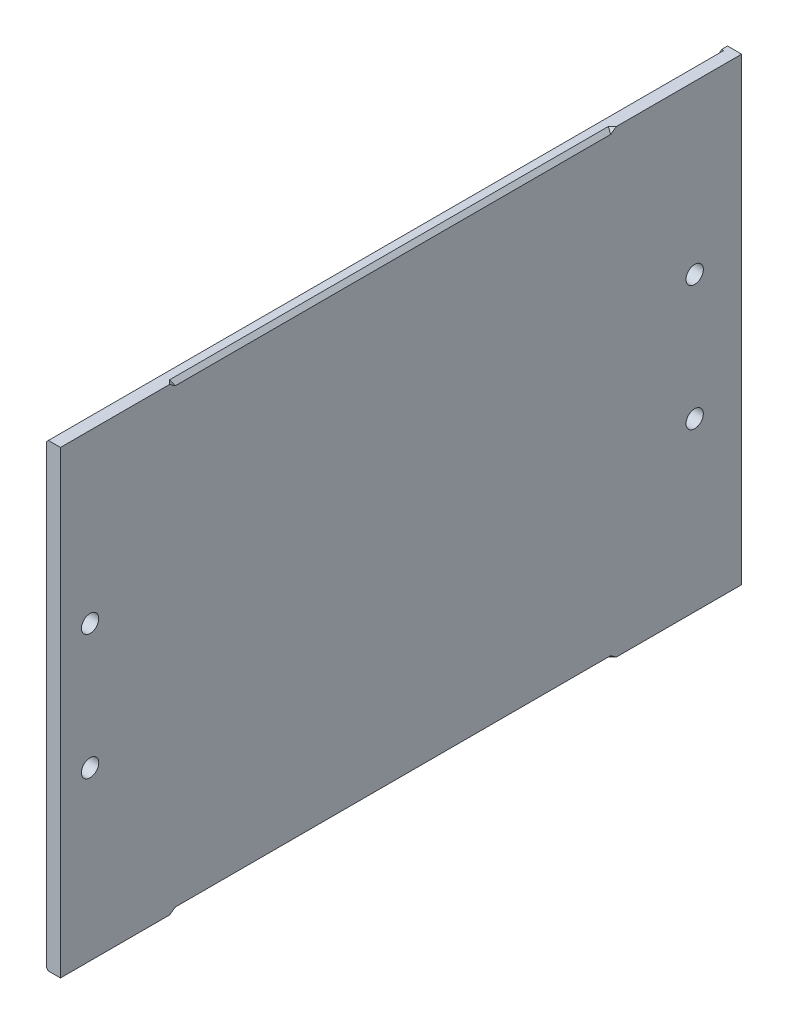
ISO-10303-21;
HEADER;
FILE_DESCRIPTION(('STEP AP214'),'2;1');
FILE_NAME('part.step','',(''),(''),'','','');
FILE_SCHEMA(('AUTOMOTIVE_DESIGN { 1 0 10303 214 1 1 1 1 }'));
ENDSEC;
DATA;
#1=APPLICATION_CONTEXT('core data for automotive mechanical design processes');
#2=APPLICATION_PROTOCOL_DEFINITION('international standard','automotive_design',2000,#1);
#3=PRODUCT_CONTEXT('',#1,'mechanical');
#4=PRODUCT('Part','Part','',(#3));
#5=PRODUCT_RELATED_PRODUCT_CATEGORY('part','',(#4));
#6=PRODUCT_DEFINITION_FORMATION('','',#4);
#7=PRODUCT_DEFINITION_CONTEXT('part definition',#1,'design');
#8=PRODUCT_DEFINITION('design','',#6,#7);
#9=PRODUCT_DEFINITION_SHAPE('','',#8);
#10=(LENGTH_UNIT() NAMED_UNIT(*) SI_UNIT(.MILLI.,.METRE.));
#11=(NAMED_UNIT(*) PLANE_ANGLE_UNIT() SI_UNIT($,.RADIAN.));
#12=(NAMED_UNIT(*) SI_UNIT($,.STERADIAN.) SOLID_ANGLE_UNIT());
#13=UNCERTAINTY_MEASURE_WITH_UNIT(LENGTH_MEASURE(1.E-05),#10,'distance_accuracy_value','');
#14=(GEOMETRIC_REPRESENTATION_CONTEXT(3) GLOBAL_UNCERTAINTY_ASSIGNED_CONTEXT((#13)) GLOBAL_UNIT_ASSIGNED_CONTEXT((#10,
#11,#12)) REPRESENTATION_CONTEXT('',''));
#15=CARTESIAN_POINT('',(0.,0.,0.));
#16=DIRECTION('',(0.,0.,1.));
#17=DIRECTION('',(1.,0.,0.));
#18=AXIS2_PLACEMENT_3D('',#15,#16,#17);
#19=CARTESIAN_POINT('',(0.,-15.5,67.65));
#20=DIRECTION('',(1.,0.,0.));
#21=DIRECTION('',(0.,0.,-1.));
#22=AXIS2_PLACEMENT_3D('',#19,#20,#21);
#23=CYLINDRICAL_SURFACE('',#22,2.15);
#24=CARTESIAN_POINT('',(128.,-15.5,67.65));
#25=DIRECTION('',(-1.,0.,0.));
#26=DIRECTION('',(0.,0.,1.));
#27=AXIS2_PLACEMENT_3D('',#24,#25,#26);
#28=CIRCLE('',#27,2.15);
#29=CARTESIAN_POINT('',(128.,-15.5,69.8));
#30=VERTEX_POINT('',#29);
#31=EDGE_CURVE('E192',#30,#30,#28,.T.);
#32=ORIENTED_EDGE('',*,*,#31,.F.);
#33=EDGE_LOOP('',(#32));
#34=FACE_BOUND('',#33,.T.);
#35=CARTESIAN_POINT('',(124.5,-15.5,67.65));
#36=DIRECTION('',(1.,0.,0.));
#37=DIRECTION('',(0.,0.,-1.));
#38=AXIS2_PLACEMENT_3D('',#35,#36,#37);
#39=CIRCLE('',#38,2.15);
#40=CARTESIAN_POINT('',(124.5,-15.5,65.5));
#41=VERTEX_POINT('',#40);
#42=EDGE_CURVE('E215',#41,#41,#39,.F.);
#43=ORIENTED_EDGE('',*,*,#42,.T.);
#44=EDGE_LOOP('',(#43));
#45=FACE_BOUND('',#44,.T.);
#46=ADVANCED_FACE('F34',(#34,#45),#23,.F.);
#47=CARTESIAN_POINT('',(0.,-15.5,217.65));
#48=DIRECTION('',(1.,0.,0.));
#49=DIRECTION('',(0.,0.,-1.));
#50=AXIS2_PLACEMENT_3D('',#47,#48,#49);
#51=CYLINDRICAL_SURFACE('',#50,2.15000000000002);
#52=CARTESIAN_POINT('',(128.,-15.5,217.65));
#53=DIRECTION('',(-1.,0.,0.));
#54=DIRECTION('',(0.,0.,1.));
#55=AXIS2_PLACEMENT_3D('',#52,#53,#54);
#56=CIRCLE('',#55,2.15000000000002);
#57=CARTESIAN_POINT('',(128.,-15.5,219.8));
#58=VERTEX_POINT('',#57);
#59=EDGE_CURVE('E202',#58,#58,#56,.T.);
#60=ORIENTED_EDGE('',*,*,#59,.F.);
#61=EDGE_LOOP('',(#60));
#62=FACE_BOUND('',#61,.T.);
#63=CARTESIAN_POINT('',(124.5,-15.5,217.65));
#64=DIRECTION('',(1.,0.,0.));
#65=DIRECTION('',(0.,0.,-1.));
#66=AXIS2_PLACEMENT_3D('',#63,#64,#65);
#67=CIRCLE('',#66,2.15000000000002);
#68=CARTESIAN_POINT('',(124.5,-15.5,215.5));
#69=VERTEX_POINT('',#68);
#70=EDGE_CURVE('E209',#69,#69,#67,.F.);
#71=ORIENTED_EDGE('',*,*,#70,.T.);
#72=EDGE_LOOP('',(#71));
#73=FACE_BOUND('',#72,.T.);
#74=ADVANCED_FACE('F320',(#62,#73),#51,.F.);
#75=CARTESIAN_POINT('',(0.,-57.,250.));
#76=DIRECTION('',(0.,-1.,0.));
#77=DIRECTION('',(0.,0.,-1.));
#78=AXIS2_PLACEMENT_3D('',#75,#76,#77);
#79=PLANE('',#78);
#80=DIRECTION('',(0.,0.,-1.));
#81=VECTOR('',#80,1.);
#82=CARTESIAN_POINT('',(125.,-57.,56.));
#83=LINE('',#82,#81);
#84=CARTESIAN_POINT('',(125.,-57.,225.));
#85=VERTEX_POINT('',#84);
#86=CARTESIAN_POINT('',(125.,-57.,57.5));
#87=VERTEX_POINT('',#86);
#88=EDGE_CURVE('E49',#85,#87,#83,.T.);
#89=ORIENTED_EDGE('',*,*,#88,.T.);
#90=DIRECTION('',(-1.,0.,0.));
#91=VECTOR('',#90,1.);
#92=CARTESIAN_POINT('',(0.,-57.,57.5));
#93=LINE('',#92,#91);
#94=CARTESIAN_POINT('',(124.5,-57.,57.5));
#95=VERTEX_POINT('',#94);
#96=EDGE_CURVE('E266',#87,#95,#93,.T.);
#97=ORIENTED_EDGE('',*,*,#96,.T.);
#98=DIRECTION('',(0.,0.,1.));
#99=VECTOR('',#98,1.);
#100=CARTESIAN_POINT('',(124.5,-57.,56.));
#101=LINE('',#100,#99);
#102=CARTESIAN_POINT('',(124.5,-57.,56.));
#103=VERTEX_POINT('',#102);
#104=EDGE_CURVE('E164',#103,#95,#101,.T.);
#105=ORIENTED_EDGE('',*,*,#104,.F.);
#106=DIRECTION('',(1.,0.,0.));
#107=VECTOR('',#106,1.);
#108=CARTESIAN_POINT('',(128.,-57.,56.));
#109=LINE('',#108,#107);
#110=CARTESIAN_POINT('',(128.,-57.,56.));
#111=VERTEX_POINT('',#110);
#112=EDGE_CURVE('E153',#103,#111,#109,.T.);
#113=ORIENTED_EDGE('',*,*,#112,.T.);
#114=DIRECTION('',(0.,0.,1.));
#115=VECTOR('',#114,1.);
#116=CARTESIAN_POINT('',(128.,-57.,88.5));
#117=LINE('',#116,#115);
#118=CARTESIAN_POINT('',(128.,-57.,87.0857864376269));
#119=VERTEX_POINT('',#118);
#120=EDGE_CURVE('E175',#111,#119,#117,.T.);
#121=ORIENTED_EDGE('',*,*,#120,.T.);
#122=DIRECTION('',(-0.707106781186554,0.,0.707106781186541));
#123=VECTOR('',#122,1.);
#124=CARTESIAN_POINT('',(127.292893218813,-57.,87.7928932188135));
#125=LINE('',#124,#123);
#126=CARTESIAN_POINT('',(127.,-57.,88.085786437627));
#127=VERTEX_POINT('',#126);
#128=EDGE_CURVE('E157',#119,#127,#125,.T.);
#129=ORIENTED_EDGE('',*,*,#128,.T.);
#130=DIRECTION('',(0.,0.,1.));
#131=VECTOR('',#130,1.);
#132=CARTESIAN_POINT('',(127.,-57.,196.5));
#133=LINE('',#132,#131);
#134=CARTESIAN_POINT('',(127.,-57.,196.914213562373));
#135=VERTEX_POINT('',#134);
#136=EDGE_CURVE('E222',#127,#135,#133,.T.);
#137=ORIENTED_EDGE('',*,*,#136,.T.);
#138=DIRECTION('',(0.707106781186543,0.,0.707106781186552));
#139=VECTOR('',#138,1.);
#140=CARTESIAN_POINT('',(133.292893218813,-57.,203.207106781187));
#141=LINE('',#140,#139);
#142=CARTESIAN_POINT('',(128.,-57.,197.914213562373));
#143=VERTEX_POINT('',#142);
#144=EDGE_CURVE('E224',#135,#143,#141,.T.);
#145=ORIENTED_EDGE('',*,*,#144,.T.);
#146=DIRECTION('',(0.,0.,1.));
#147=VECTOR('',#146,1.);
#148=CARTESIAN_POINT('',(128.,-57.,196.5));
#149=LINE('',#148,#147);
#150=CARTESIAN_POINT('',(128.,-57.,225.));
#151=VERTEX_POINT('',#150);
#152=EDGE_CURVE('E169',#143,#151,#149,.T.);
#153=ORIENTED_EDGE('',*,*,#152,.T.);
#154=DIRECTION('',(-1.,0.,0.));
#155=VECTOR('',#154,1.);
#156=CARTESIAN_POINT('',(128.,-57.,225.));
#157=LINE('',#156,#155);
#158=EDGE_CURVE('E172',#151,#85,#157,.T.);
#159=ORIENTED_EDGE('',*,*,#158,.T.);
#160=EDGE_LOOP('',(#89,#97,#105,#113,#121,#129,#137,#145,#153,#159));
#161=FACE_BOUND('',#160,.T.);
#162=ADVANCED_FACE('F299',(#161),#79,.T.);
#163=CARTESIAN_POINT('',(0.,15.5,67.65));
#164=DIRECTION('',(1.,0.,0.));
#165=DIRECTION('',(0.,0.,-1.));
#166=AXIS2_PLACEMENT_3D('',#163,#164,#165);
#167=CYLINDRICAL_SURFACE('',#166,2.15);
#168=CARTESIAN_POINT('',(128.,15.5,67.65));
#169=DIRECTION('',(-1.,0.,0.));
#170=DIRECTION('',(0.,0.,1.));
#171=AXIS2_PLACEMENT_3D('',#168,#169,#170);
#172=CIRCLE('',#171,2.15);
#173=CARTESIAN_POINT('',(128.,15.5,69.8));
#174=VERTEX_POINT('',#173);
#175=EDGE_CURVE('E189',#174,#174,#172,.F.);
#176=ORIENTED_EDGE('',*,*,#175,.T.);
#177=EDGE_LOOP('',(#176));
#178=FACE_BOUND('',#177,.T.);
#179=CARTESIAN_POINT('',(124.5,15.5,67.65));
#180=DIRECTION('',(1.,0.,0.));
#181=DIRECTION('',(0.,0.,-1.));
#182=AXIS2_PLACEMENT_3D('',#179,#180,#181);
#183=CIRCLE('',#182,2.15);
#184=CARTESIAN_POINT('',(124.5,15.5,65.5));
#185=VERTEX_POINT('',#184);
#186=EDGE_CURVE('E208',#185,#185,#183,.T.);
#187=ORIENTED_EDGE('',*,*,#186,.F.);
#188=EDGE_LOOP('',(#187));
#189=FACE_BOUND('',#188,.T.);
#190=ADVANCED_FACE('F334',(#178,#189),#167,.F.);
#191=CARTESIAN_POINT('',(0.,15.5,217.65));
#192=DIRECTION('',(1.,0.,0.));
#193=DIRECTION('',(0.,0.,-1.));
#194=AXIS2_PLACEMENT_3D('',#191,#192,#193);
#195=CYLINDRICAL_SURFACE('',#194,2.15000000000002);
#196=CARTESIAN_POINT('',(128.,15.5,217.65));
#197=DIRECTION('',(-1.,0.,0.));
#198=DIRECTION('',(0.,0.,1.));
#199=AXIS2_PLACEMENT_3D('',#196,#197,#198);
#200=CIRCLE('',#199,2.15000000000002);
#201=CARTESIAN_POINT('',(128.,15.5,219.8));
#202=VERTEX_POINT('',#201);
#203=EDGE_CURVE('E199',#202,#202,#200,.F.);
#204=ORIENTED_EDGE('',*,*,#203,.T.);
#205=EDGE_LOOP('',(#204));
#206=FACE_BOUND('',#205,.T.);
#207=CARTESIAN_POINT('',(124.5,15.5,217.65));
#208=DIRECTION('',(1.,0.,0.));
#209=DIRECTION('',(0.,0.,-1.));
#210=AXIS2_PLACEMENT_3D('',#207,#208,#209);
#211=CIRCLE('',#210,2.15000000000002);
#212=CARTESIAN_POINT('',(124.5,15.5,215.5));
#213=VERTEX_POINT('',#212);
#214=EDGE_CURVE('E158',#213,#213,#211,.T.);
#215=ORIENTED_EDGE('',*,*,#214,.F.);
#216=EDGE_LOOP('',(#215));
#217=FACE_BOUND('',#216,.T.);
#218=ADVANCED_FACE('F335',(#206,#217),#195,.F.);
#219=CARTESIAN_POINT('',(124.5,53.5,3.5));
#220=DIRECTION('',(1.,0.,0.));
#221=DIRECTION('',(0.,0.,-1.));
#222=AXIS2_PLACEMENT_3D('',#219,#220,#221);
#223=PLANE('',#222);
#224=ORIENTED_EDGE('',*,*,#70,.F.);
#225=EDGE_LOOP('',(#224));
#226=FACE_BOUND('',#225,.T.);
#227=ORIENTED_EDGE('',*,*,#42,.F.);
#228=EDGE_LOOP('',(#227));
#229=FACE_BOUND('',#228,.T.);
#230=ORIENTED_EDGE('',*,*,#186,.T.);
#231=EDGE_LOOP('',(#230));
#232=FACE_BOUND('',#231,.T.);
#233=ORIENTED_EDGE('',*,*,#214,.T.);
#234=EDGE_LOOP('',(#233));
#235=FACE_BOUND('',#234,.T.);
#236=DIRECTION('',(0.,0.,-1.));
#237=VECTOR('',#236,1.);
#238=CARTESIAN_POINT('',(124.5,56.5,3.5));
#239=LINE('',#238,#237);
#240=CARTESIAN_POINT('',(124.5,56.5,225.));
#241=VERTEX_POINT('',#240);
#242=CARTESIAN_POINT('',(124.5,56.5,58.));
#243=VERTEX_POINT('',#242);
#244=EDGE_CURVE('E252',#241,#243,#239,.T.);
#245=ORIENTED_EDGE('',*,*,#244,.T.);
#246=DIRECTION('',(0.,0.707106781186548,-0.707106781186548));
#247=VECTOR('',#246,1.);
#248=CARTESIAN_POINT('',(124.5,57.,57.5));
#249=LINE('',#248,#247);
#250=CARTESIAN_POINT('',(124.5,57.,57.5));
#251=VERTEX_POINT('',#250);
#252=EDGE_CURVE('E163',#243,#251,#249,.T.);
#253=ORIENTED_EDGE('',*,*,#252,.T.);
#254=DIRECTION('',(0.,0.,1.));
#255=VECTOR('',#254,1.);
#256=CARTESIAN_POINT('',(124.5,57.,56.));
#257=LINE('',#256,#255);
#258=CARTESIAN_POINT('',(124.5,57.,56.));
#259=VERTEX_POINT('',#258);
#260=EDGE_CURVE('E141',#259,#251,#257,.T.);
#261=ORIENTED_EDGE('',*,*,#260,.F.);
#262=DIRECTION('',(0.,1.,0.));
#263=VECTOR('',#262,1.);
#264=CARTESIAN_POINT('',(124.5,-172.023834660552,56.));
#265=LINE('',#264,#263);
#266=EDGE_CURVE('E151',#103,#259,#265,.T.);
#267=ORIENTED_EDGE('',*,*,#266,.F.);
#268=ORIENTED_EDGE('',*,*,#104,.T.);
#269=DIRECTION('',(0.,-0.707106781186552,-0.707106781186543));
#270=VECTOR('',#269,1.);
#271=CARTESIAN_POINT('',(124.5,-56.5,58.));
#272=LINE('',#271,#270);
#273=CARTESIAN_POINT('',(124.5,-56.5,58.));
#274=VERTEX_POINT('',#273);
#275=EDGE_CURVE('E56',#95,#274,#272,.F.);
#276=ORIENTED_EDGE('',*,*,#275,.T.);
#277=DIRECTION('',(0.,0.,1.));
#278=VECTOR('',#277,1.);
#279=CARTESIAN_POINT('',(124.5,-56.5,225.));
#280=LINE('',#279,#278);
#281=CARTESIAN_POINT('',(124.5,-56.5,225.));
#282=VERTEX_POINT('',#281);
#283=EDGE_CURVE('E254',#274,#282,#280,.T.);
#284=ORIENTED_EDGE('',*,*,#283,.T.);
#285=DIRECTION('',(0.,1.,0.));
#286=VECTOR('',#285,1.);
#287=CARTESIAN_POINT('',(124.5,0.,225.));
#288=LINE('',#287,#286);
#289=EDGE_CURVE('E206',#282,#241,#288,.T.);
#290=ORIENTED_EDGE('',*,*,#289,.T.);
#291=EDGE_LOOP('',(#245,#253,#261,#267,#268,#276,#284,#290));
#292=FACE_BOUND('',#291,.T.);
#293=ADVANCED_FACE('F161',(#226,#229,#232,#235,#292),#223,.F.);
#294=CARTESIAN_POINT('',(0.,57.,250.));
#295=DIRECTION('',(0.,-1.,0.));
#296=DIRECTION('',(0.,0.,-1.));
#297=AXIS2_PLACEMENT_3D('',#294,#295,#296);
#298=PLANE('',#297);
#299=ORIENTED_EDGE('',*,*,#260,.T.);
#300=DIRECTION('',(1.,0.,0.));
#301=VECTOR('',#300,1.);
#302=CARTESIAN_POINT('',(125.,57.,57.5));
#303=LINE('',#302,#301);
#304=CARTESIAN_POINT('',(125.,57.,57.5));
#305=VERTEX_POINT('',#304);
#306=EDGE_CURVE('E262',#251,#305,#303,.T.);
#307=ORIENTED_EDGE('',*,*,#306,.T.);
#308=DIRECTION('',(0.,0.,1.));
#309=VECTOR('',#308,1.);
#310=CARTESIAN_POINT('',(125.,57.,250.));
#311=LINE('',#310,#309);
#312=CARTESIAN_POINT('',(125.,57.,225.));
#313=VERTEX_POINT('',#312);
#314=EDGE_CURVE('E260',#305,#313,#311,.T.);
#315=ORIENTED_EDGE('',*,*,#314,.T.);
#316=DIRECTION('',(-1.,0.,0.));
#317=VECTOR('',#316,1.);
#318=CARTESIAN_POINT('',(128.,57.,225.));
#319=LINE('',#318,#317);
#320=CARTESIAN_POINT('',(128.,57.,225.));
#321=VERTEX_POINT('',#320);
#322=EDGE_CURVE('E148',#321,#313,#319,.T.);
#323=ORIENTED_EDGE('',*,*,#322,.F.);
#324=DIRECTION('',(0.,0.,1.));
#325=VECTOR('',#324,1.);
#326=CARTESIAN_POINT('',(128.,57.,196.5));
#327=LINE('',#326,#325);
#328=CARTESIAN_POINT('',(128.,57.,197.914213562373));
#329=VERTEX_POINT('',#328);
#330=EDGE_CURVE('E166',#329,#321,#327,.T.);
#331=ORIENTED_EDGE('',*,*,#330,.F.);
#332=DIRECTION('',(-0.707106781186544,0.,-0.707106781186551));
#333=VECTOR('',#332,1.);
#334=CARTESIAN_POINT('',(90.042893218814,57.,159.957106781187));
#335=LINE('',#334,#333);
#336=CARTESIAN_POINT('',(127.,57.,196.914213562373));
#337=VERTEX_POINT('',#336);
#338=EDGE_CURVE('E231',#329,#337,#335,.T.);
#339=ORIENTED_EDGE('',*,*,#338,.T.);
#340=DIRECTION('',(0.,0.,-1.));
#341=VECTOR('',#340,1.);
#342=CARTESIAN_POINT('',(127.,57.,250.));
#343=LINE('',#342,#341);
#344=CARTESIAN_POINT('',(127.,57.,88.0857864376269));
#345=VERTEX_POINT('',#344);
#346=EDGE_CURVE('E229',#337,#345,#343,.T.);
#347=ORIENTED_EDGE('',*,*,#346,.T.);
#348=DIRECTION('',(0.707106781186551,0.,-0.707106781186544));
#349=VECTOR('',#348,1.);
#350=CARTESIAN_POINT('',(-17.4571067811872,57.,232.542893218813));
#351=LINE('',#350,#349);
#352=CARTESIAN_POINT('',(128.,57.,87.0857864376269));
#353=VERTEX_POINT('',#352);
#354=EDGE_CURVE('E227',#345,#353,#351,.T.);
#355=ORIENTED_EDGE('',*,*,#354,.T.);
#356=DIRECTION('',(0.,0.,1.));
#357=VECTOR('',#356,1.);
#358=CARTESIAN_POINT('',(128.,57.,88.5));
#359=LINE('',#358,#357);
#360=CARTESIAN_POINT('',(128.,57.,56.));
#361=VERTEX_POINT('',#360);
#362=EDGE_CURVE('E144',#361,#353,#359,.T.);
#363=ORIENTED_EDGE('',*,*,#362,.F.);
#364=DIRECTION('',(1.,0.,0.));
#365=VECTOR('',#364,1.);
#366=CARTESIAN_POINT('',(128.,57.,56.));
#367=LINE('',#366,#365);
#368=EDGE_CURVE('E136',#259,#361,#367,.T.);
#369=ORIENTED_EDGE('',*,*,#368,.F.);
#370=EDGE_LOOP('',(#299,#307,#315,#323,#331,#339,#347,#355,#363,#369));
#371=FACE_BOUND('',#370,.T.);
#372=ADVANCED_FACE('F138',(#371),#298,.F.);
#373=CARTESIAN_POINT('',(128.,57.,202.5));
#374=DIRECTION('',(-1.,0.,0.));
#375=DIRECTION('',(0.,0.,1.));
#376=AXIS2_PLACEMENT_3D('',#373,#374,#375);
#377=PLANE('',#376);
#378=DIRECTION('',(0.,-0.577350269189612,0.816496580927736));
#379=VECTOR('',#378,1.);
#380=CARTESIAN_POINT('',(128.,-11.569137717834,184.05719095842));
#381=LINE('',#380,#379);
#382=CARTESIAN_POINT('',(128.,56.,88.5));
#383=VERTEX_POINT('',#382);
#384=EDGE_CURVE('E185',#353,#383,#381,.T.);
#385=ORIENTED_EDGE('',*,*,#384,.T.);
#386=DIRECTION('',(0.,0.,1.));
#387=VECTOR('',#386,1.);
#388=CARTESIAN_POINT('',(128.,56.,202.5));
#389=LINE('',#388,#387);
#390=CARTESIAN_POINT('',(128.,55.9999999999999,196.5));
#391=VERTEX_POINT('',#390);
#392=EDGE_CURVE('E236',#383,#391,#389,.T.);
#393=ORIENTED_EDGE('',*,*,#392,.T.);
#394=DIRECTION('',(0.,0.577350269189615,0.816496580927734));
#395=VECTOR('',#394,1.);
#396=CARTESIAN_POINT('',(128.,39.106848267201,172.609475708248));
#397=LINE('',#396,#395);
#398=EDGE_CURVE('E197',#391,#329,#397,.T.);
#399=ORIENTED_EDGE('',*,*,#398,.T.);
#400=ORIENTED_EDGE('',*,*,#330,.T.);
#401=DIRECTION('',(0.,1.,0.));
#402=VECTOR('',#401,1.);
#403=CARTESIAN_POINT('',(128.,-57.,225.));
#404=LINE('',#403,#402);
#405=EDGE_CURVE('E178',#151,#321,#404,.T.);
#406=ORIENTED_EDGE('',*,*,#405,.F.);
#407=ORIENTED_EDGE('',*,*,#152,.F.);
#408=DIRECTION('',(0.,0.577350269189632,-0.816496580927721));
#409=VECTOR('',#408,1.);
#410=CARTESIAN_POINT('',(128.,-39.1068482672008,172.609475708249));
#411=LINE('',#410,#409);
#412=CARTESIAN_POINT('',(128.,-56.,196.5));
#413=VERTEX_POINT('',#412);
#414=EDGE_CURVE('E195',#143,#413,#411,.T.);
#415=ORIENTED_EDGE('',*,*,#414,.T.);
#416=DIRECTION('',(0.,0.,-1.));
#417=VECTOR('',#416,1.);
#418=CARTESIAN_POINT('',(128.,-56.,88.5000000000001));
#419=LINE('',#418,#417);
#420=CARTESIAN_POINT('',(128.,-55.9999999999999,88.5000000000001));
#421=VERTEX_POINT('',#420);
#422=EDGE_CURVE('E233',#413,#421,#419,.T.);
#423=ORIENTED_EDGE('',*,*,#422,.T.);
#424=DIRECTION('',(0.,-0.577350269189635,-0.81649658092772));
#425=VECTOR('',#424,1.);
#426=CARTESIAN_POINT('',(128.,11.569137717835,184.057190958415));
#427=LINE('',#426,#425);
#428=EDGE_CURVE('E239',#421,#119,#427,.T.);
#429=ORIENTED_EDGE('',*,*,#428,.T.);
#430=ORIENTED_EDGE('',*,*,#120,.F.);
#431=DIRECTION('',(0.,1.,0.));
#432=VECTOR('',#431,1.);
#433=CARTESIAN_POINT('',(128.,-57.,56.));
#434=LINE('',#433,#432);
#435=EDGE_CURVE('E183',#111,#361,#434,.T.);
#436=ORIENTED_EDGE('',*,*,#435,.T.);
#437=ORIENTED_EDGE('',*,*,#362,.T.);
#438=EDGE_LOOP('',(#385,#393,#399,#400,#406,#407,#415,#423,#429,#430,#436,#437));
#439=FACE_BOUND('',#438,.T.);
#440=ORIENTED_EDGE('',*,*,#59,.T.);
#441=EDGE_LOOP('',(#440));
#442=FACE_BOUND('',#441,.T.);
#443=ORIENTED_EDGE('',*,*,#203,.F.);
#444=EDGE_LOOP('',(#443));
#445=FACE_BOUND('',#444,.T.);
#446=ORIENTED_EDGE('',*,*,#31,.T.);
#447=EDGE_LOOP('',(#446));
#448=FACE_BOUND('',#447,.T.);
#449=ORIENTED_EDGE('',*,*,#175,.F.);
#450=EDGE_LOOP('',(#449));
#451=FACE_BOUND('',#450,.T.);
#452=ADVANCED_FACE('F281',(#439,#442,#445,#448,#451),#377,.F.);
#453=CARTESIAN_POINT('',(90.042893218814,57.,159.957106781187));
#454=DIRECTION('',(0.499999999999996,0.707106781186556,-0.499999999999992));
#455=DIRECTION('',(0.707106781186544,0.,0.707106781186551));
#456=AXIS2_PLACEMENT_3D('',#453,#454,#455);
#457=PLANE('',#456);
#458=ORIENTED_EDGE('',*,*,#398,.F.);
#459=DIRECTION('',(-0.678598344545857,0.678598344545838,0.281084637714819));
#460=VECTOR('',#459,1.);
#461=CARTESIAN_POINT('',(117.030741232288,66.9692587677113,201.043615750766));
#462=LINE('',#461,#460);
#463=EDGE_CURVE('E218',#337,#391,#462,.F.);
#464=ORIENTED_EDGE('',*,*,#463,.F.);
#465=ORIENTED_EDGE('',*,*,#338,.F.);
#466=EDGE_LOOP('',(#458,#464,#465));
#467=FACE_BOUND('',#466,.T.);
#468=ADVANCED_FACE('F287',(#467),#457,.T.);
#469=CARTESIAN_POINT('',(127.,57.,250.));
#470=DIRECTION('',(-0.707106781186538,-0.707106781186557,0.));
#471=DIRECTION('',(0.,0.,-1.));
#472=AXIS2_PLACEMENT_3D('',#469,#470,#471);
#473=PLANE('',#472);
#474=ORIENTED_EDGE('',*,*,#463,.T.);
#475=ORIENTED_EDGE('',*,*,#392,.F.);
#476=DIRECTION('',(-0.678598344545853,0.678598344545834,-0.281084637714838));
#477=VECTOR('',#476,1.);
#478=CARTESIAN_POINT('',(157.884095101195,26.1159048988062,100.878397490163));
#479=LINE('',#478,#477);
#480=EDGE_CURVE('E245',#345,#383,#479,.F.);
#481=ORIENTED_EDGE('',*,*,#480,.F.);
#482=ORIENTED_EDGE('',*,*,#346,.F.);
#483=EDGE_LOOP('',(#474,#475,#481,#482));
#484=FACE_BOUND('',#483,.T.);
#485=ADVANCED_FACE('F292',(#484),#473,.F.);
#486=CARTESIAN_POINT('',(90.0428932188143,-57.,159.957106781187));
#487=DIRECTION('',(0.500000000000009,-0.707106781186539,-0.500000000000003));
#488=DIRECTION('',(-0.707106781186543,0.,-0.707106781186552));
#489=AXIS2_PLACEMENT_3D('',#486,#487,#488);
#490=PLANE('',#489);
#491=ORIENTED_EDGE('',*,*,#414,.F.);
#492=ORIENTED_EDGE('',*,*,#144,.F.);
#493=DIRECTION('',(-0.678598344545866,-0.678598344545847,0.281084637714775));
#494=VECTOR('',#493,1.);
#495=CARTESIAN_POINT('',(117.030741232287,-66.9692587677127,201.043615750766));
#496=LINE('',#495,#494);
#497=EDGE_CURVE('E242',#413,#135,#496,.T.);
#498=ORIENTED_EDGE('',*,*,#497,.F.);
#499=EDGE_LOOP('',(#491,#492,#498));
#500=FACE_BOUND('',#499,.T.);
#501=ADVANCED_FACE('F310',(#500),#490,.T.);
#502=CARTESIAN_POINT('',(-17.4571067811872,57.,232.542893218813));
#503=DIRECTION('',(0.499999999999987,0.707106781186562,0.499999999999992));
#504=DIRECTION('',(-0.707106781186551,0.,0.707106781186544));
#505=AXIS2_PLACEMENT_3D('',#502,#503,#504);
#506=PLANE('',#505);
#507=ORIENTED_EDGE('',*,*,#384,.F.);
#508=ORIENTED_EDGE('',*,*,#354,.F.);
#509=ORIENTED_EDGE('',*,*,#480,.T.);
#510=EDGE_LOOP('',(#507,#508,#509));
#511=FACE_BOUND('',#510,.T.);
#512=ADVANCED_FACE('F296',(#511),#506,.T.);
#513=CARTESIAN_POINT('',(128.,-56.,202.5));
#514=DIRECTION('',(0.707106781186538,-0.707106781186557,0.));
#515=DIRECTION('',(0.,0.,1.));
#516=AXIS2_PLACEMENT_3D('',#513,#514,#515);
#517=PLANE('',#516);
#518=ORIENTED_EDGE('',*,*,#497,.T.);
#519=ORIENTED_EDGE('',*,*,#136,.F.);
#520=DIRECTION('',(-0.678598344545863,-0.678598344545844,-0.28108463771479));
#521=VECTOR('',#520,1.);
#522=CARTESIAN_POINT('',(149.74476696068,-34.2552330393201,97.5069773857551));
#523=LINE('',#522,#521);
#524=EDGE_CURVE('E205',#421,#127,#523,.T.);
#525=ORIENTED_EDGE('',*,*,#524,.F.);
#526=ORIENTED_EDGE('',*,*,#422,.F.);
#527=EDGE_LOOP('',(#518,#519,#525,#526));
#528=FACE_BOUND('',#527,.T.);
#529=ADVANCED_FACE('F306',(#528),#517,.T.);
#530=CARTESIAN_POINT('',(-17.4571067811878,-57.,232.542893218812));
#531=DIRECTION('',(0.499999999999999,-0.707106781186543,0.500000000000008));
#532=DIRECTION('',(0.707106781186554,0.,-0.707106781186541));
#533=AXIS2_PLACEMENT_3D('',#530,#531,#532);
#534=PLANE('',#533);
#535=ORIENTED_EDGE('',*,*,#428,.F.);
#536=ORIENTED_EDGE('',*,*,#524,.T.);
#537=ORIENTED_EDGE('',*,*,#128,.F.);
#538=EDGE_LOOP('',(#535,#536,#537));
#539=FACE_BOUND('',#538,.T.);
#540=ADVANCED_FACE('F302',(#539),#534,.T.);
#541=CARTESIAN_POINT('',(128.,-57.,56.));
#542=DIRECTION('',(0.,0.,1.));
#543=DIRECTION('',(1.,0.,0.));
#544=AXIS2_PLACEMENT_3D('',#541,#542,#543);
#545=PLANE('',#544);
#546=ORIENTED_EDGE('',*,*,#112,.F.);
#547=ORIENTED_EDGE('',*,*,#266,.T.);
#548=ORIENTED_EDGE('',*,*,#368,.T.);
#549=ORIENTED_EDGE('',*,*,#435,.F.);
#550=EDGE_LOOP('',(#546,#547,#548,#549));
#551=FACE_BOUND('',#550,.T.);
#552=ADVANCED_FACE('F152',(#551),#545,.F.);
#553=CARTESIAN_POINT('',(128.,-57.,225.));
#554=DIRECTION('',(0.,0.,-1.));
#555=DIRECTION('',(-1.,0.,0.));
#556=AXIS2_PLACEMENT_3D('',#553,#554,#555);
#557=PLANE('',#556);
#558=ORIENTED_EDGE('',*,*,#289,.F.);
#559=DIRECTION('',(0.707106781186538,-0.707106781186557,0.));
#560=VECTOR('',#559,1.);
#561=CARTESIAN_POINT('',(125.,-57.,225.));
#562=LINE('',#561,#560);
#563=EDGE_CURVE('E258',#282,#85,#562,.T.);
#564=ORIENTED_EDGE('',*,*,#563,.T.);
#565=ORIENTED_EDGE('',*,*,#158,.F.);
#566=ORIENTED_EDGE('',*,*,#405,.T.);
#567=ORIENTED_EDGE('',*,*,#322,.T.);
#568=DIRECTION('',(0.707106781186557,0.707106781186538,0.));
#569=VECTOR('',#568,1.);
#570=CARTESIAN_POINT('',(124.5,56.5,225.));
#571=LINE('',#570,#569);
#572=EDGE_CURVE('E256',#313,#241,#571,.F.);
#573=ORIENTED_EDGE('',*,*,#572,.T.);
#574=EDGE_LOOP('',(#558,#564,#565,#566,#567,#573));
#575=FACE_BOUND('',#574,.T.);
#576=ADVANCED_FACE('F278',(#575),#557,.F.);
#577=CARTESIAN_POINT('',(125.,-57.,250.));
#578=DIRECTION('',(-0.707106781186557,-0.707106781186538,0.));
#579=DIRECTION('',(0.,0.,1.));
#580=AXIS2_PLACEMENT_3D('',#577,#578,#579);
#581=PLANE('',#580);
#582=ORIENTED_EDGE('',*,*,#283,.F.);
#583=DIRECTION('',(-0.577350269189618,0.577350269189634,0.577350269189626));
#584=VECTOR('',#583,1.);
#585=CARTESIAN_POINT('',(124.5,-56.5,58.));
#586=LINE('',#585,#584);
#587=EDGE_CURVE('E12',#274,#87,#586,.F.);
#588=ORIENTED_EDGE('',*,*,#587,.T.);
#589=ORIENTED_EDGE('',*,*,#88,.F.);
#590=ORIENTED_EDGE('',*,*,#563,.F.);
#591=EDGE_LOOP('',(#582,#588,#589,#590));
#592=FACE_BOUND('',#591,.T.);
#593=ADVANCED_FACE('F366',(#592),#581,.T.);
#594=CARTESIAN_POINT('',(124.5,56.5,3.5));
#595=DIRECTION('',(0.707106781186538,-0.707106781186557,0.));
#596=DIRECTION('',(0.,0.,-1.));
#597=AXIS2_PLACEMENT_3D('',#594,#595,#596);
#598=PLANE('',#597);
#599=ORIENTED_EDGE('',*,*,#314,.F.);
#600=DIRECTION('',(0.577350269189637,0.577350269189621,-0.577350269189621));
#601=VECTOR('',#600,1.);
#602=CARTESIAN_POINT('',(83.3333333333318,15.3333333333329,99.1666666666671));
#603=LINE('',#602,#601);
#604=EDGE_CURVE('E42',#305,#243,#603,.F.);
#605=ORIENTED_EDGE('',*,*,#604,.T.);
#606=ORIENTED_EDGE('',*,*,#244,.F.);
#607=ORIENTED_EDGE('',*,*,#572,.F.);
#608=EDGE_LOOP('',(#599,#605,#606,#607));
#609=FACE_BOUND('',#608,.T.);
#610=ADVANCED_FACE('F270',(#609),#598,.F.);
#611=CARTESIAN_POINT('',(0.,57.,57.5));
#612=DIRECTION('',(0.,0.707106781186547,0.707106781186547));
#613=DIRECTION('',(-1.,0.,0.));
#614=AXIS2_PLACEMENT_3D('',#611,#612,#613);
#615=PLANE('',#614);
#616=ORIENTED_EDGE('',*,*,#306,.F.);
#617=ORIENTED_EDGE('',*,*,#252,.F.);
#618=ORIENTED_EDGE('',*,*,#604,.F.);
#619=EDGE_LOOP('',(#616,#617,#618));
#620=FACE_BOUND('',#619,.T.);
#621=ADVANCED_FACE('F274',(#620),#615,.T.);
#622=CARTESIAN_POINT('',(124.5,-56.5,58.));
#623=DIRECTION('',(0.,0.707106781186542,-0.707106781186552));
#624=DIRECTION('',(1.,0.,0.));
#625=AXIS2_PLACEMENT_3D('',#622,#623,#624);
#626=PLANE('',#625);
#627=ORIENTED_EDGE('',*,*,#275,.F.);
#628=ORIENTED_EDGE('',*,*,#96,.F.);
#629=ORIENTED_EDGE('',*,*,#587,.F.);
#630=EDGE_LOOP('',(#627,#628,#629));
#631=FACE_BOUND('',#630,.T.);
#632=ADVANCED_FACE('F36',(#631),#626,.F.);
#633=CLOSED_SHELL('',(#46,#74,#162,#190,#218,#293,#372,#452,#468,#485,#501,#512,#529,#540,#552,
#576,#593,#610,#621,#632));
#634=MANIFOLD_SOLID_BREP('B2',#633);
#635=ADVANCED_BREP_SHAPE_REPRESENTATION('',(#18,#634),#14);
#636=SHAPE_DEFINITION_REPRESENTATION(#9,#635);
ENDSEC;
END-ISO-10303-21;
